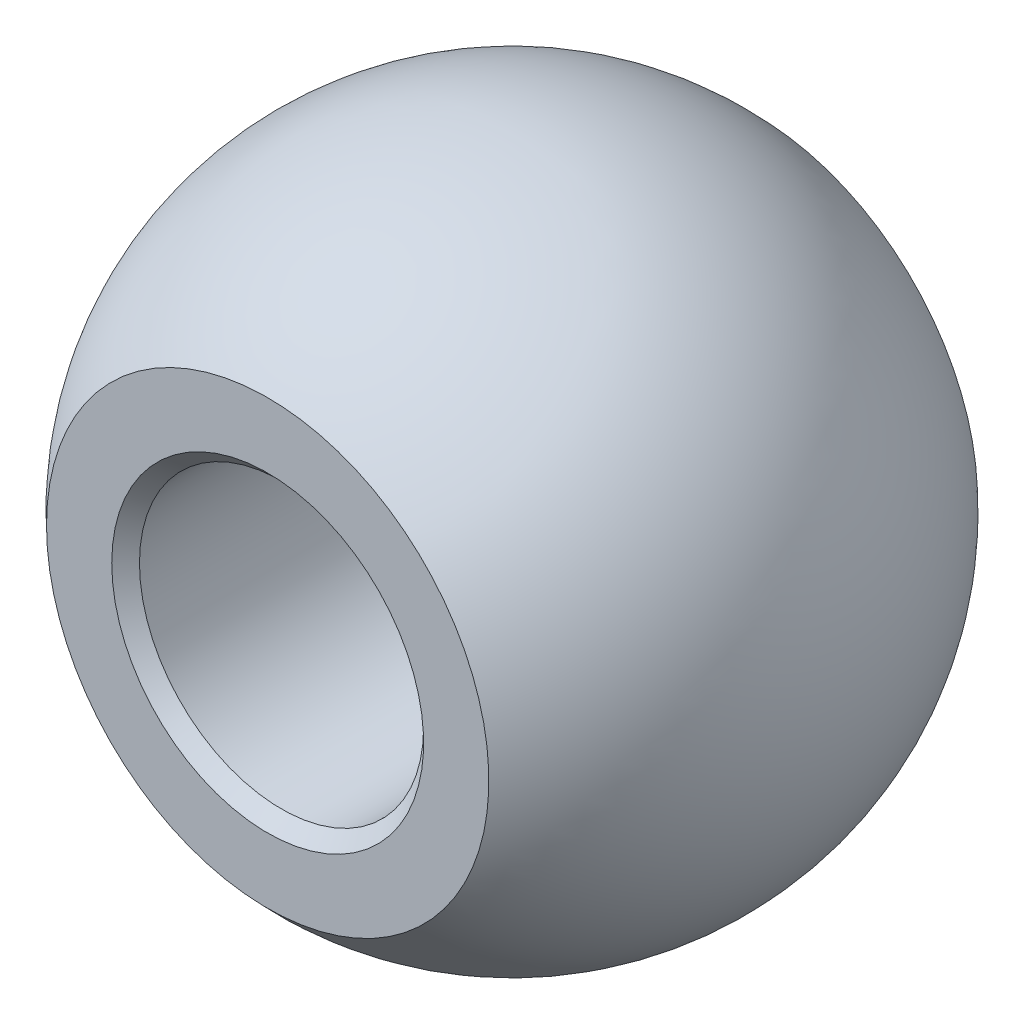
ISO-10303-21;
HEADER;
FILE_DESCRIPTION(('STEP AP214'),'2;1');
FILE_NAME('part.step','',(''),(''),'','','');
FILE_SCHEMA(('AUTOMOTIVE_DESIGN { 1 0 10303 214 1 1 1 1 }'));
ENDSEC;
DATA;
#1=APPLICATION_CONTEXT('core data for automotive mechanical design processes');
#2=APPLICATION_PROTOCOL_DEFINITION('international standard','automotive_design',2000,#1);
#3=PRODUCT_CONTEXT('',#1,'mechanical');
#4=PRODUCT('Part','Part','',(#3));
#5=PRODUCT_RELATED_PRODUCT_CATEGORY('part','',(#4));
#6=PRODUCT_DEFINITION_FORMATION('','',#4);
#7=PRODUCT_DEFINITION_CONTEXT('part definition',#1,'design');
#8=PRODUCT_DEFINITION('design','',#6,#7);
#9=PRODUCT_DEFINITION_SHAPE('','',#8);
#10=(LENGTH_UNIT() NAMED_UNIT(*) SI_UNIT(.MILLI.,.METRE.));
#11=(NAMED_UNIT(*) PLANE_ANGLE_UNIT() SI_UNIT($,.RADIAN.));
#12=(NAMED_UNIT(*) SI_UNIT($,.STERADIAN.) SOLID_ANGLE_UNIT());
#13=UNCERTAINTY_MEASURE_WITH_UNIT(LENGTH_MEASURE(1.E-05),#10,'distance_accuracy_value','');
#14=(GEOMETRIC_REPRESENTATION_CONTEXT(3) GLOBAL_UNCERTAINTY_ASSIGNED_CONTEXT((#13)) GLOBAL_UNIT_ASSIGNED_CONTEXT((#10,
#11,#12)) REPRESENTATION_CONTEXT('',''));
#15=CARTESIAN_POINT('',(0.,0.,0.));
#16=DIRECTION('',(0.,0.,1.));
#17=DIRECTION('',(1.,0.,0.));
#18=AXIS2_PLACEMENT_3D('',#15,#16,#17);
#19=CARTESIAN_POINT('',(0.,-4.755,-3.525));
#20=DIRECTION('',(0.,0.,-1.));
#21=DIRECTION('',(0.,-1.,0.));
#22=AXIS2_PLACEMENT_3D('',#19,#20,#21);
#23=PLANE('',#22);
#24=CARTESIAN_POINT('',(0.,0.,-3.52500000001));
#25=DIRECTION('',(0.,0.,-1.));
#26=DIRECTION('',(-1.,0.,0.));
#27=AXIS2_PLACEMENT_3D('',#24,#25,#26);
#28=CIRCLE('',#27,2.25000000001);
#29=CARTESIAN_POINT('',(-2.25000000001,0.,-3.52500000001));
#30=VERTEX_POINT('',#29);
#31=EDGE_CURVE('E69',#30,#30,#28,.T.);
#32=ORIENTED_EDGE('',*,*,#31,.F.);
#33=EDGE_LOOP('',(#32));
#34=FACE_BOUND('',#33,.T.);
#35=CARTESIAN_POINT('',(0.,0.,-3.52500000001));
#36=DIRECTION('',(0.,0.,-1.));
#37=DIRECTION('',(-1.,0.,0.));
#38=AXIS2_PLACEMENT_3D('',#35,#36,#37);
#39=CIRCLE('',#38,3.19130067528333);
#40=CARTESIAN_POINT('',(-3.19130067528333,0.,-3.52500000001));
#41=VERTEX_POINT('',#40);
#42=EDGE_CURVE('E25',#41,#41,#39,.T.);
#43=ORIENTED_EDGE('',*,*,#42,.T.);
#44=EDGE_LOOP('',(#43));
#45=FACE_BOUND('',#44,.T.);
#46=ADVANCED_FACE('F17',(#34,#45),#23,.T.);
#47=CARTESIAN_POINT('',(0.,-4.755,3.525));
#48=DIRECTION('',(0.,0.,-1.));
#49=DIRECTION('',(0.,-1.,0.));
#50=AXIS2_PLACEMENT_3D('',#47,#48,#49);
#51=PLANE('',#50);
#52=CARTESIAN_POINT('',(0.,0.,3.52500000001));
#53=DIRECTION('',(0.,0.,-1.));
#54=DIRECTION('',(-1.,0.,0.));
#55=AXIS2_PLACEMENT_3D('',#52,#53,#54);
#56=CIRCLE('',#55,2.25000000001);
#57=CARTESIAN_POINT('',(-2.25000000001,0.,3.52500000001));
#58=VERTEX_POINT('',#57);
#59=EDGE_CURVE('E58',#58,#58,#56,.T.);
#60=ORIENTED_EDGE('',*,*,#59,.T.);
#61=EDGE_LOOP('',(#60));
#62=FACE_BOUND('',#61,.T.);
#63=CARTESIAN_POINT('',(0.,0.,3.52500000001));
#64=DIRECTION('',(0.,0.,-1.));
#65=DIRECTION('',(-1.,0.,0.));
#66=AXIS2_PLACEMENT_3D('',#63,#64,#65);
#67=CIRCLE('',#66,3.19130067528333);
#68=CARTESIAN_POINT('',(-3.19130067528333,0.,3.52500000001));
#69=VERTEX_POINT('',#68);
#70=EDGE_CURVE('E11',#69,#69,#67,.T.);
#71=ORIENTED_EDGE('',*,*,#70,.F.);
#72=EDGE_LOOP('',(#71));
#73=FACE_BOUND('',#72,.T.);
#74=ADVANCED_FACE('F59',(#62,#73),#51,.F.);
#75=CARTESIAN_POINT('',(0.,0.,-4.755));
#76=DIRECTION('',(0.,0.,1.));
#77=DIRECTION('',(1.,0.,0.));
#78=AXIS2_PLACEMENT_3D('',#75,#76,#77);
#79=CYLINDRICAL_SURFACE('',#78,2.05);
#80=CARTESIAN_POINT('',(0.,0.,-3.32500000001));
#81=DIRECTION('',(0.,0.,-1.));
#82=DIRECTION('',(-1.,0.,0.));
#83=AXIS2_PLACEMENT_3D('',#80,#81,#82);
#84=CIRCLE('',#83,2.05000000001);
#85=CARTESIAN_POINT('',(-2.05000000001,0.,-3.32500000001));
#86=VERTEX_POINT('',#85);
#87=EDGE_CURVE('E74',#86,#86,#84,.T.);
#88=ORIENTED_EDGE('',*,*,#87,.T.);
#89=EDGE_LOOP('',(#88));
#90=FACE_BOUND('',#89,.T.);
#91=CARTESIAN_POINT('',(0.,0.,3.32500000001));
#92=DIRECTION('',(0.,0.,-1.));
#93=DIRECTION('',(1.,0.,0.));
#94=AXIS2_PLACEMENT_3D('',#91,#92,#93);
#95=CIRCLE('',#94,2.05000000001);
#96=CARTESIAN_POINT('',(2.05000000001,0.,3.32500000001));
#97=VERTEX_POINT('',#96);
#98=EDGE_CURVE('E63',#97,#97,#95,.T.);
#99=ORIENTED_EDGE('',*,*,#98,.F.);
#100=EDGE_LOOP('',(#99));
#101=FACE_BOUND('',#100,.T.);
#102=ADVANCED_FACE('F114',(#90,#101),#79,.F.);
#103=CARTESIAN_POINT('',(0.,0.,0.));
#104=DIRECTION('',(0.,-1.,0.));
#105=DIRECTION('',(1.,0.,0.));
#106=AXIS2_PLACEMENT_3D('',#103,#104,#105);
#107=SPHERICAL_SURFACE('',#106,4.755);
#108=CARTESIAN_POINT('',(0.,0.,0.));
#109=DIRECTION('',(0.,0.,-1.));
#110=DIRECTION('',(-1.,0.,0.));
#111=AXIS2_PLACEMENT_3D('',#108,#109,#110);
#112=SPHERICAL_SURFACE('',#111,4.755);
#113=ORIENTED_EDGE('',*,*,#70,.T.);
#114=EDGE_LOOP('',(#113));
#115=FACE_BOUND('',#114,.T.);
#116=ORIENTED_EDGE('',*,*,#42,.F.);
#117=EDGE_LOOP('',(#116));
#118=FACE_BOUND('',#117,.T.);
#119=ADVANCED_FACE('F118',(#115,#118),#112,.T.);
#120=CARTESIAN_POINT('',(0.,0.,-3.525));
#121=DIRECTION('',(0.,0.,-1.));
#122=DIRECTION('',(-1.,0.,0.));
#123=AXIS2_PLACEMENT_3D('',#120,#121,#122);
#124=CONICAL_SURFACE('',#123,2.25,0.78539816339745);
#125=ORIENTED_EDGE('',*,*,#87,.F.);
#126=EDGE_LOOP('',(#125));
#127=FACE_BOUND('',#126,.T.);
#128=ORIENTED_EDGE('',*,*,#31,.T.);
#129=EDGE_LOOP('',(#128));
#130=FACE_BOUND('',#129,.T.);
#131=ADVANCED_FACE('F128',(#127,#130),#124,.F.);
#132=CARTESIAN_POINT('',(0.,0.,3.525));
#133=DIRECTION('',(0.,0.,1.));
#134=DIRECTION('',(-1.,0.,0.));
#135=AXIS2_PLACEMENT_3D('',#132,#133,#134);
#136=CONICAL_SURFACE('',#135,2.25,0.78539816339745);
#137=ORIENTED_EDGE('',*,*,#98,.T.);
#138=EDGE_LOOP('',(#137));
#139=FACE_BOUND('',#138,.T.);
#140=ORIENTED_EDGE('',*,*,#59,.F.);
#141=EDGE_LOOP('',(#140));
#142=FACE_BOUND('',#141,.T.);
#143=ADVANCED_FACE('F124',(#139,#142),#136,.F.);
#144=CLOSED_SHELL('',(#46,#74,#102,#119,#131,#143));
#145=MANIFOLD_SOLID_BREP('B1',#144);
#146=ADVANCED_BREP_SHAPE_REPRESENTATION('',(#18,#145),#14);
#147=SHAPE_DEFINITION_REPRESENTATION(#9,#146);
ENDSEC;
END-ISO-10303-21;
